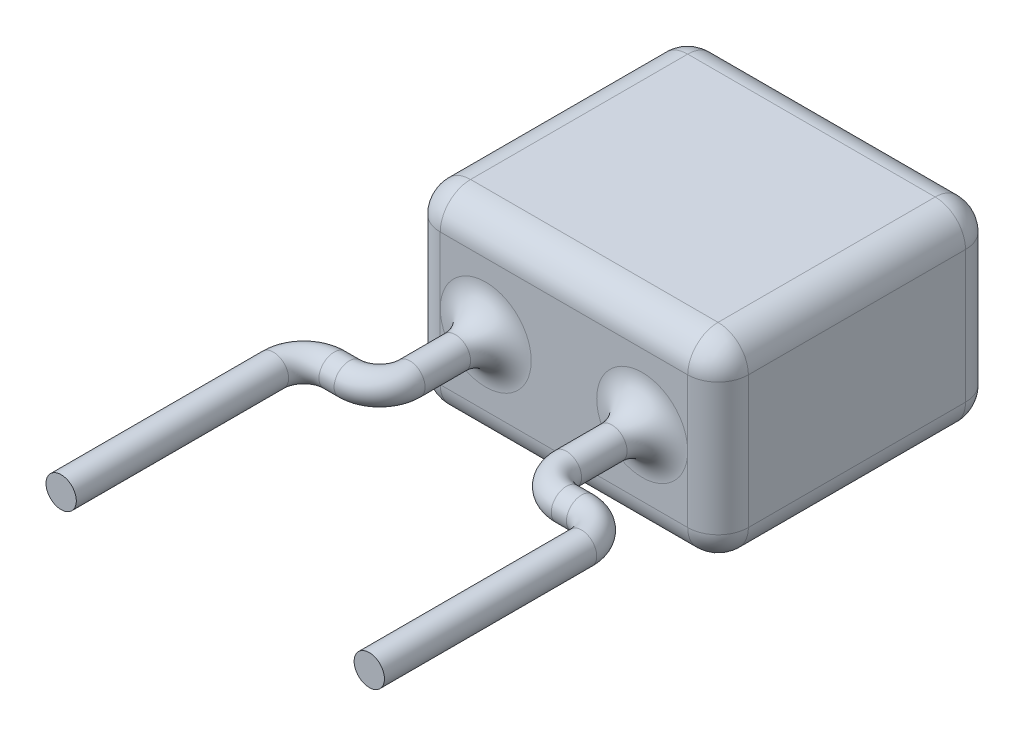
ISO-10303-21;
HEADER;
FILE_DESCRIPTION(('STEP AP214'),'2;1');
FILE_NAME('part.step','',(''),(''),'','','');
FILE_SCHEMA(('AUTOMOTIVE_DESIGN { 1 0 10303 214 1 1 1 1 }'));
ENDSEC;
DATA;
#1=APPLICATION_CONTEXT('core data for automotive mechanical design processes');
#2=APPLICATION_PROTOCOL_DEFINITION('international standard','automotive_design',2000,#1);
#3=PRODUCT_CONTEXT('',#1,'mechanical');
#4=PRODUCT('Part','Part','',(#3));
#5=PRODUCT_RELATED_PRODUCT_CATEGORY('part','',(#4));
#6=PRODUCT_DEFINITION_FORMATION('','',#4);
#7=PRODUCT_DEFINITION_CONTEXT('part definition',#1,'design');
#8=PRODUCT_DEFINITION('design','',#6,#7);
#9=PRODUCT_DEFINITION_SHAPE('','',#8);
#10=(LENGTH_UNIT() NAMED_UNIT(*) SI_UNIT(.MILLI.,.METRE.));
#11=(NAMED_UNIT(*) PLANE_ANGLE_UNIT() SI_UNIT($,.RADIAN.));
#12=(NAMED_UNIT(*) SI_UNIT($,.STERADIAN.) SOLID_ANGLE_UNIT());
#13=UNCERTAINTY_MEASURE_WITH_UNIT(LENGTH_MEASURE(1.E-05),#10,'distance_accuracy_value','');
#14=(GEOMETRIC_REPRESENTATION_CONTEXT(3) GLOBAL_UNCERTAINTY_ASSIGNED_CONTEXT((#13)) GLOBAL_UNIT_ASSIGNED_CONTEXT((#10,
#11,#12)) REPRESENTATION_CONTEXT('',''));
#15=CARTESIAN_POINT('',(0.,0.,0.));
#16=DIRECTION('',(0.,0.,1.));
#17=DIRECTION('',(1.,0.,0.));
#18=AXIS2_PLACEMENT_3D('',#15,#16,#17);
#19=CARTESIAN_POINT('',(-65.,11.1441902468932,3.75));
#20=DIRECTION('',(0.,0.,-1.));
#21=DIRECTION('',(0.,1.,0.));
#22=AXIS2_PLACEMENT_3D('',#19,#20,#21);
#23=PLANE('',#22);
#24=CARTESIAN_POINT('',(-2.53999999999999,0.,3.74999999999999));
#25=DIRECTION('',(0.,0.,1.));
#26=DIRECTION('',(0.,-1.,0.));
#27=AXIS2_PLACEMENT_3D('',#24,#25,#26);
#28=CIRCLE('',#27,0.25);
#29=CARTESIAN_POINT('',(-2.53999999999999,-0.250000000000002,3.74999999999999));
#30=VERTEX_POINT('',#29);
#31=EDGE_CURVE('E165',#30,#30,#28,.F.);
#32=ORIENTED_EDGE('',*,*,#31,.F.);
#33=EDGE_LOOP('',(#32));
#34=FACE_BOUND('',#33,.T.);
#35=ADVANCED_FACE('F17',(#34),#23,.F.);
#36=CARTESIAN_POINT('',(-65.,11.1441902468932,3.75));
#37=DIRECTION('',(0.,0.,-1.));
#38=DIRECTION('',(0.,1.,0.));
#39=AXIS2_PLACEMENT_3D('',#36,#37,#38);
#40=PLANE('',#39);
#41=CARTESIAN_POINT('',(2.54,0.,3.74999999999999));
#42=DIRECTION('',(0.,0.,1.));
#43=DIRECTION('',(0.,-1.,0.));
#44=AXIS2_PLACEMENT_3D('',#41,#42,#43);
#45=CIRCLE('',#44,0.25);
#46=CARTESIAN_POINT('',(2.54,-0.250000000000003,3.74999999999999));
#47=VERTEX_POINT('',#46);
#48=EDGE_CURVE('E161',#47,#47,#45,.F.);
#49=ORIENTED_EDGE('',*,*,#48,.F.);
#50=EDGE_LOOP('',(#49));
#51=FACE_BOUND('',#50,.T.);
#52=ADVANCED_FACE('F770',(#51),#40,.F.);
#53=CARTESIAN_POINT('',(-2.53999999999999,0.,0.25));
#54=DIRECTION('',(0.,0.,1.));
#55=DIRECTION('',(0.,-1.,0.));
#56=AXIS2_PLACEMENT_3D('',#53,#54,#55);
#57=CYLINDRICAL_SURFACE('',#56,0.25);
#58=ORIENTED_EDGE('',*,*,#31,.T.);
#59=EDGE_LOOP('',(#58));
#60=FACE_BOUND('',#59,.T.);
#61=CARTESIAN_POINT('',(-2.54,0.,0.25));
#62=DIRECTION('',(0.,0.,-1.));
#63=DIRECTION('',(-1.,0.,0.));
#64=AXIS2_PLACEMENT_3D('',#61,#62,#63);
#65=CIRCLE('',#64,0.25);
#66=CARTESIAN_POINT('',(-2.79,0.,0.25));
#67=VERTEX_POINT('',#66);
#68=EDGE_CURVE('E164',#67,#67,#65,.T.);
#69=ORIENTED_EDGE('',*,*,#68,.F.);
#70=EDGE_LOOP('',(#69));
#71=FACE_BOUND('',#70,.T.);
#72=ADVANCED_FACE('F763',(#60,#71),#57,.T.);
#73=CARTESIAN_POINT('',(2.54,0.,0.250000000000001));
#74=DIRECTION('',(0.,0.,1.));
#75=DIRECTION('',(0.,-1.,0.));
#76=AXIS2_PLACEMENT_3D('',#73,#74,#75);
#77=CYLINDRICAL_SURFACE('',#76,0.25);
#78=ORIENTED_EDGE('',*,*,#48,.T.);
#79=EDGE_LOOP('',(#78));
#80=FACE_BOUND('',#79,.T.);
#81=CARTESIAN_POINT('',(2.54,0.,0.250000000000001));
#82=DIRECTION('',(0.,0.,1.));
#83=DIRECTION('',(1.,0.,0.));
#84=AXIS2_PLACEMENT_3D('',#81,#82,#83);
#85=CIRCLE('',#84,0.25);
#86=CARTESIAN_POINT('',(2.79,0.,0.250000000000001));
#87=VERTEX_POINT('',#86);
#88=EDGE_CURVE('E363',#87,#87,#85,.F.);
#89=ORIENTED_EDGE('',*,*,#88,.F.);
#90=EDGE_LOOP('',(#89));
#91=FACE_BOUND('',#90,.T.);
#92=ADVANCED_FACE('F358',(#80,#91),#77,.T.);
#93=CARTESIAN_POINT('',(-2.04,0.,0.25));
#94=DIRECTION('',(0.,-1.,0.));
#95=DIRECTION('',(0.,0.,-1.));
#96=AXIS2_PLACEMENT_3D('',#93,#94,#95);
#97=TOROIDAL_SURFACE('',#96,0.5,0.25);
#98=ORIENTED_EDGE('',*,*,#68,.T.);
#99=EDGE_LOOP('',(#98));
#100=FACE_BOUND('',#99,.T.);
#101=CARTESIAN_POINT('',(-2.04,0.,-0.25));
#102=DIRECTION('',(1.,0.,0.));
#103=DIRECTION('',(0.,1.,0.));
#104=AXIS2_PLACEMENT_3D('',#101,#102,#103);
#105=CIRCLE('',#104,0.25);
#106=CARTESIAN_POINT('',(-2.04,0.25,-0.25));
#107=VERTEX_POINT('',#106);
#108=EDGE_CURVE('E345',#107,#107,#105,.T.);
#109=ORIENTED_EDGE('',*,*,#108,.F.);
#110=EDGE_LOOP('',(#109));
#111=FACE_BOUND('',#110,.T.);
#112=ADVANCED_FACE('F354',(#100,#111),#97,.T.);
#113=CARTESIAN_POINT('',(2.04,0.,0.250000000000001));
#114=DIRECTION('',(0.,-1.,0.));
#115=DIRECTION('',(1.,0.,0.));
#116=AXIS2_PLACEMENT_3D('',#113,#114,#115);
#117=TOROIDAL_SURFACE('',#116,0.500000000000001,0.25);
#118=CARTESIAN_POINT('',(2.04,0.,-0.25));
#119=DIRECTION('',(1.,0.,0.));
#120=DIRECTION('',(0.,0.,-1.));
#121=AXIS2_PLACEMENT_3D('',#118,#119,#120);
#122=CIRCLE('',#121,0.25);
#123=CARTESIAN_POINT('',(2.04,0.,-0.499999999999999));
#124=VERTEX_POINT('',#123);
#125=EDGE_CURVE('E342',#124,#124,#122,.F.);
#126=ORIENTED_EDGE('',*,*,#125,.F.);
#127=EDGE_LOOP('',(#126));
#128=FACE_BOUND('',#127,.T.);
#129=ORIENTED_EDGE('',*,*,#88,.T.);
#130=EDGE_LOOP('',(#129));
#131=FACE_BOUND('',#130,.T.);
#132=ADVANCED_FACE('F350',(#128,#131),#117,.T.);
#133=CARTESIAN_POINT('',(-2.04,0.,-0.25));
#134=DIRECTION('',(1.,0.,0.));
#135=DIRECTION('',(0.,1.,0.));
#136=AXIS2_PLACEMENT_3D('',#133,#134,#135);
#137=CYLINDRICAL_SURFACE('',#136,0.25);
#138=ORIENTED_EDGE('',*,*,#108,.T.);
#139=EDGE_LOOP('',(#138));
#140=FACE_BOUND('',#139,.T.);
#141=CARTESIAN_POINT('',(-1.79,0.,-0.249999999999999));
#142=DIRECTION('',(1.,0.,0.));
#143=DIRECTION('',(0.,0.,1.));
#144=AXIS2_PLACEMENT_3D('',#141,#142,#143);
#145=CIRCLE('',#144,0.25);
#146=CARTESIAN_POINT('',(-1.79,0.,0.));
#147=VERTEX_POINT('',#146);
#148=EDGE_CURVE('E339',#147,#147,#145,.T.);
#149=ORIENTED_EDGE('',*,*,#148,.F.);
#150=EDGE_LOOP('',(#149));
#151=FACE_BOUND('',#150,.T.);
#152=ADVANCED_FACE('F353',(#140,#151),#137,.T.);
#153=CARTESIAN_POINT('',(1.79,0.,-0.25));
#154=DIRECTION('',(1.,0.,0.));
#155=DIRECTION('',(0.,0.,-1.));
#156=AXIS2_PLACEMENT_3D('',#153,#154,#155);
#157=CYLINDRICAL_SURFACE('',#156,0.25);
#158=ORIENTED_EDGE('',*,*,#125,.T.);
#159=EDGE_LOOP('',(#158));
#160=FACE_BOUND('',#159,.T.);
#161=CARTESIAN_POINT('',(1.79,0.,-0.25));
#162=DIRECTION('',(1.,0.,0.));
#163=DIRECTION('',(0.,0.,1.));
#164=AXIS2_PLACEMENT_3D('',#161,#162,#163);
#165=CIRCLE('',#164,0.25);
#166=CARTESIAN_POINT('',(1.79,0.,0.));
#167=VERTEX_POINT('',#166);
#168=EDGE_CURVE('E336',#167,#167,#165,.F.);
#169=ORIENTED_EDGE('',*,*,#168,.F.);
#170=EDGE_LOOP('',(#169));
#171=FACE_BOUND('',#170,.T.);
#172=ADVANCED_FACE('F330',(#160,#171),#157,.T.);
#173=CARTESIAN_POINT('',(-1.79,0.,-0.749999999999999));
#174=DIRECTION('',(0.,1.,0.));
#175=DIRECTION('',(0.,0.,1.));
#176=AXIS2_PLACEMENT_3D('',#173,#174,#175);
#177=TOROIDAL_SURFACE('',#176,0.499999999999999,0.25);
#178=CARTESIAN_POINT('',(-1.29,0.,-0.749999999999999));
#179=DIRECTION('',(0.,0.,-1.));
#180=DIRECTION('',(0.,1.,0.));
#181=AXIS2_PLACEMENT_3D('',#178,#179,#180);
#182=CIRCLE('',#181,0.25);
#183=CARTESIAN_POINT('',(-1.29,0.25,-0.75));
#184=VERTEX_POINT('',#183);
#185=EDGE_CURVE('E335',#184,#184,#182,.T.);
#186=ORIENTED_EDGE('',*,*,#185,.F.);
#187=EDGE_LOOP('',(#186));
#188=FACE_BOUND('',#187,.T.);
#189=ORIENTED_EDGE('',*,*,#148,.T.);
#190=EDGE_LOOP('',(#189));
#191=FACE_BOUND('',#190,.T.);
#192=ADVANCED_FACE('F325',(#188,#191),#177,.T.);
#193=CARTESIAN_POINT('',(1.79,0.,-0.749999999999999));
#194=DIRECTION('',(0.,1.,0.));
#195=DIRECTION('',(-1.,0.,0.));
#196=AXIS2_PLACEMENT_3D('',#193,#194,#195);
#197=TOROIDAL_SURFACE('',#196,0.499999999999999,0.25);
#198=ORIENTED_EDGE('',*,*,#168,.T.);
#199=EDGE_LOOP('',(#198));
#200=FACE_BOUND('',#199,.T.);
#201=CARTESIAN_POINT('',(1.29,0.,-0.749999999999998));
#202=DIRECTION('',(0.,0.,1.));
#203=DIRECTION('',(0.,-1.,0.));
#204=AXIS2_PLACEMENT_3D('',#201,#202,#203);
#205=CIRCLE('',#204,0.25);
#206=CARTESIAN_POINT('',(1.29,-0.250000000000003,-0.749999999999999));
#207=VERTEX_POINT('',#206);
#208=EDGE_CURVE('E231',#207,#207,#205,.F.);
#209=ORIENTED_EDGE('',*,*,#208,.F.);
#210=EDGE_LOOP('',(#209));
#211=FACE_BOUND('',#210,.T.);
#212=ADVANCED_FACE('F320',(#200,#211),#197,.T.);
#213=CARTESIAN_POINT('',(-1.29,0.,-0.749999999999999));
#214=DIRECTION('',(0.,0.,-1.));
#215=DIRECTION('',(0.,1.,0.));
#216=AXIS2_PLACEMENT_3D('',#213,#214,#215);
#217=CYLINDRICAL_SURFACE('',#216,0.25);
#218=ORIENTED_EDGE('',*,*,#185,.T.);
#219=EDGE_LOOP('',(#218));
#220=FACE_BOUND('',#219,.T.);
#221=CARTESIAN_POINT('',(-1.29,0.,-1.5));
#222=DIRECTION('',(0.,0.,1.));
#223=DIRECTION('',(1.,0.,0.));
#224=AXIS2_PLACEMENT_3D('',#221,#222,#223);
#225=CIRCLE('',#224,0.25);
#226=CARTESIAN_POINT('',(-1.04,0.,-1.5));
#227=VERTEX_POINT('',#226);
#228=EDGE_CURVE('E310',#227,#227,#225,.T.);
#229=ORIENTED_EDGE('',*,*,#228,.T.);
#230=EDGE_LOOP('',(#229));
#231=FACE_BOUND('',#230,.T.);
#232=ADVANCED_FACE('F324',(#220,#231),#217,.T.);
#233=CARTESIAN_POINT('',(1.29,0.,-2.5));
#234=DIRECTION('',(0.,0.,1.));
#235=DIRECTION('',(0.,-1.,0.));
#236=AXIS2_PLACEMENT_3D('',#233,#234,#235);
#237=CYLINDRICAL_SURFACE('',#236,0.25);
#238=CARTESIAN_POINT('',(1.29,0.,-1.5));
#239=DIRECTION('',(0.,0.,1.));
#240=DIRECTION('',(1.,0.,0.));
#241=AXIS2_PLACEMENT_3D('',#238,#239,#240);
#242=CIRCLE('',#241,0.25);
#243=CARTESIAN_POINT('',(1.54,0.,-1.5));
#244=VERTEX_POINT('',#243);
#245=EDGE_CURVE('E227',#244,#244,#242,.T.);
#246=ORIENTED_EDGE('',*,*,#245,.T.);
#247=EDGE_LOOP('',(#246));
#248=FACE_BOUND('',#247,.T.);
#249=ORIENTED_EDGE('',*,*,#208,.T.);
#250=EDGE_LOOP('',(#249));
#251=FACE_BOUND('',#250,.T.);
#252=ADVANCED_FACE('F717',(#248,#251),#237,.T.);
#253=CARTESIAN_POINT('',(2.04,-1.09000000000001,-2.5));
#254=DIRECTION('',(1.,0.,0.));
#255=DIRECTION('',(0.,0.,-1.));
#256=AXIS2_PLACEMENT_3D('',#253,#254,#255);
#257=SPHERICAL_SURFACE('',#256,0.5);
#258=CARTESIAN_POINT('',(2.04,-1.09000000000001,-2.5));
#259=DIRECTION('',(0.,1.,0.));
#260=DIRECTION('',(-1.,0.,0.));
#261=AXIS2_PLACEMENT_3D('',#258,#259,#260);
#262=CIRCLE('',#261,0.5);
#263=CARTESIAN_POINT('',(2.04,-1.09000000000001,-2.));
#264=VERTEX_POINT('',#263);
#265=CARTESIAN_POINT('',(2.54,-1.09000000000001,-2.5));
#266=VERTEX_POINT('',#265);
#267=EDGE_CURVE('E218',#264,#266,#262,.T.);
#268=ORIENTED_EDGE('',*,*,#267,.F.);
#269=CARTESIAN_POINT('',(2.04,-1.09000000000001,-2.5));
#270=DIRECTION('',(1.,0.,0.));
#271=DIRECTION('',(0.,1.,0.));
#272=AXIS2_PLACEMENT_3D('',#269,#270,#271);
#273=CIRCLE('',#272,0.5);
#274=CARTESIAN_POINT('',(2.04,-1.59,-2.5));
#275=VERTEX_POINT('',#274);
#276=EDGE_CURVE('E128',#275,#264,#273,.F.);
#277=ORIENTED_EDGE('',*,*,#276,.F.);
#278=CARTESIAN_POINT('',(2.04,-1.08999999999999,-2.5));
#279=DIRECTION('',(0.,0.,1.));
#280=DIRECTION('',(1.,0.,0.));
#281=AXIS2_PLACEMENT_3D('',#278,#279,#280);
#282=CIRCLE('',#281,0.5);
#283=EDGE_CURVE('E285',#266,#275,#282,.F.);
#284=ORIENTED_EDGE('',*,*,#283,.F.);
#285=EDGE_LOOP('',(#268,#277,#284));
#286=FACE_BOUND('',#285,.T.);
#287=ADVANCED_FACE('F260',(#286),#257,.T.);
#288=CARTESIAN_POINT('',(2.04,-1.09000000000001,-6.08));
#289=DIRECTION('',(1.,0.,0.));
#290=DIRECTION('',(0.,0.,-1.));
#291=AXIS2_PLACEMENT_3D('',#288,#289,#290);
#292=SPHERICAL_SURFACE('',#291,0.5);
#293=CARTESIAN_POINT('',(2.04,-1.09000000000001,-6.08));
#294=DIRECTION('',(0.,1.,0.));
#295=DIRECTION('',(-1.,0.,0.));
#296=AXIS2_PLACEMENT_3D('',#293,#294,#295);
#297=CIRCLE('',#296,0.5);
#298=CARTESIAN_POINT('',(2.54,-1.09000000000001,-6.08));
#299=VERTEX_POINT('',#298);
#300=CARTESIAN_POINT('',(2.04,-1.09,-6.58));
#301=VERTEX_POINT('',#300);
#302=EDGE_CURVE('E269',#299,#301,#297,.T.);
#303=ORIENTED_EDGE('',*,*,#302,.F.);
#304=CARTESIAN_POINT('',(2.04,-1.08999999999999,-6.08));
#305=DIRECTION('',(0.,0.,1.));
#306=DIRECTION('',(1.,0.,0.));
#307=AXIS2_PLACEMENT_3D('',#304,#305,#306);
#308=CIRCLE('',#307,0.5);
#309=CARTESIAN_POINT('',(2.04,-1.59,-6.08));
#310=VERTEX_POINT('',#309);
#311=EDGE_CURVE('E226',#310,#299,#308,.T.);
#312=ORIENTED_EDGE('',*,*,#311,.F.);
#313=CARTESIAN_POINT('',(2.04,-1.09000000000001,-6.08));
#314=DIRECTION('',(1.,0.,0.));
#315=DIRECTION('',(0.,1.,0.));
#316=AXIS2_PLACEMENT_3D('',#313,#314,#315);
#317=CIRCLE('',#316,0.5);
#318=EDGE_CURVE('E272',#301,#310,#317,.F.);
#319=ORIENTED_EDGE('',*,*,#318,.F.);
#320=EDGE_LOOP('',(#303,#312,#319));
#321=FACE_BOUND('',#320,.T.);
#322=ADVANCED_FACE('F255',(#321),#292,.T.);
#323=CARTESIAN_POINT('',(2.54,-1.58999999999999,-6.58));
#324=DIRECTION('',(0.,-1.,0.));
#325=DIRECTION('',(1.,0.,0.));
#326=AXIS2_PLACEMENT_3D('',#323,#324,#325);
#327=PLANE('',#326);
#328=DIRECTION('',(1.,0.,0.));
#329=VECTOR('',#328,1.);
#330=CARTESIAN_POINT('',(2.54,-1.59000000000001,-6.08));
#331=LINE('',#330,#329);
#332=CARTESIAN_POINT('',(-2.04,-1.59,-6.08));
#333=VERTEX_POINT('',#332);
#334=EDGE_CURVE('E546',#310,#333,#331,.F.);
#335=ORIENTED_EDGE('',*,*,#334,.F.);
#336=DIRECTION('',(0.,0.,1.));
#337=VECTOR('',#336,1.);
#338=CARTESIAN_POINT('',(2.04,-1.58999999999999,-6.58));
#339=LINE('',#338,#337);
#340=EDGE_CURVE('E273',#275,#310,#339,.F.);
#341=ORIENTED_EDGE('',*,*,#340,.F.);
#342=DIRECTION('',(1.,0.,0.));
#343=VECTOR('',#342,1.);
#344=CARTESIAN_POINT('',(0.,-1.59000000000001,-2.5));
#345=LINE('',#344,#343);
#346=CARTESIAN_POINT('',(-2.04,-1.59,-2.5));
#347=VERTEX_POINT('',#346);
#348=EDGE_CURVE('E127',#347,#275,#345,.T.);
#349=ORIENTED_EDGE('',*,*,#348,.F.);
#350=DIRECTION('',(0.,0.,1.));
#351=VECTOR('',#350,1.);
#352=CARTESIAN_POINT('',(-2.04,-1.58999999999999,-6.58));
#353=LINE('',#352,#351);
#354=EDGE_CURVE('E529',#333,#347,#353,.T.);
#355=ORIENTED_EDGE('',*,*,#354,.F.);
#356=EDGE_LOOP('',(#335,#341,#349,#355));
#357=FACE_BOUND('',#356,.T.);
#358=ADVANCED_FACE('F252',(#357),#327,.T.);
#359=CARTESIAN_POINT('',(-2.04,-1.09000000000001,-2.5));
#360=DIRECTION('',(1.,0.,0.));
#361=DIRECTION('',(0.,0.,-1.));
#362=AXIS2_PLACEMENT_3D('',#359,#360,#361);
#363=SPHERICAL_SURFACE('',#362,0.5);
#364=CARTESIAN_POINT('',(-2.04,-1.09000000000001,-2.5));
#365=DIRECTION('',(1.,0.,0.));
#366=DIRECTION('',(0.,1.,0.));
#367=AXIS2_PLACEMENT_3D('',#364,#365,#366);
#368=CIRCLE('',#367,0.5);
#369=CARTESIAN_POINT('',(-2.04,-1.09000000000001,-2.));
#370=VERTEX_POINT('',#369);
#371=EDGE_CURVE('E118',#370,#347,#368,.T.);
#372=ORIENTED_EDGE('',*,*,#371,.F.);
#373=CARTESIAN_POINT('',(-2.04,-1.09000000000001,-2.5));
#374=DIRECTION('',(0.,-1.,0.));
#375=DIRECTION('',(1.,0.,0.));
#376=AXIS2_PLACEMENT_3D('',#373,#374,#375);
#377=CIRCLE('',#376,0.5);
#378=CARTESIAN_POINT('',(-2.54,-1.09000000000001,-2.5));
#379=VERTEX_POINT('',#378);
#380=EDGE_CURVE('E121',#379,#370,#377,.F.);
#381=ORIENTED_EDGE('',*,*,#380,.F.);
#382=CARTESIAN_POINT('',(-2.04,-1.08999999999999,-2.5));
#383=DIRECTION('',(0.,0.,1.));
#384=DIRECTION('',(1.,0.,0.));
#385=AXIS2_PLACEMENT_3D('',#382,#383,#384);
#386=CIRCLE('',#385,0.5);
#387=EDGE_CURVE('E123',#347,#379,#386,.F.);
#388=ORIENTED_EDGE('',*,*,#387,.F.);
#389=EDGE_LOOP('',(#372,#381,#388));
#390=FACE_BOUND('',#389,.T.);
#391=ADVANCED_FACE('F120',(#390),#363,.T.);
#392=CARTESIAN_POINT('',(-2.04,-1.09000000000001,-6.08));
#393=DIRECTION('',(1.,0.,0.));
#394=DIRECTION('',(0.,0.,-1.));
#395=AXIS2_PLACEMENT_3D('',#392,#393,#394);
#396=SPHERICAL_SURFACE('',#395,0.5);
#397=CARTESIAN_POINT('',(-2.04,-1.09000000000001,-6.08));
#398=DIRECTION('',(1.,0.,0.));
#399=DIRECTION('',(0.,1.,0.));
#400=AXIS2_PLACEMENT_3D('',#397,#398,#399);
#401=CIRCLE('',#400,0.5);
#402=CARTESIAN_POINT('',(-2.04,-1.09,-6.58));
#403=VERTEX_POINT('',#402);
#404=EDGE_CURVE('E537',#333,#403,#401,.T.);
#405=ORIENTED_EDGE('',*,*,#404,.F.);
#406=CARTESIAN_POINT('',(-2.04,-1.08999999999999,-6.08));
#407=DIRECTION('',(0.,0.,1.));
#408=DIRECTION('',(1.,0.,0.));
#409=AXIS2_PLACEMENT_3D('',#406,#407,#408);
#410=CIRCLE('',#409,0.5);
#411=CARTESIAN_POINT('',(-2.54,-1.09000000000001,-6.08));
#412=VERTEX_POINT('',#411);
#413=EDGE_CURVE('E532',#412,#333,#410,.T.);
#414=ORIENTED_EDGE('',*,*,#413,.F.);
#415=CARTESIAN_POINT('',(-2.04,-1.08999999999999,-6.08));
#416=DIRECTION('',(0.,-1.,0.));
#417=DIRECTION('',(1.,0.,0.));
#418=AXIS2_PLACEMENT_3D('',#415,#416,#417);
#419=CIRCLE('',#418,0.5);
#420=EDGE_CURVE('E140',#403,#412,#419,.F.);
#421=ORIENTED_EDGE('',*,*,#420,.F.);
#422=EDGE_LOOP('',(#405,#414,#421));
#423=FACE_BOUND('',#422,.T.);
#424=ADVANCED_FACE('F246',(#423),#396,.T.);
#425=CARTESIAN_POINT('',(0.,-1.09000000000001,-2.5));
#426=DIRECTION('',(1.,0.,0.));
#427=DIRECTION('',(0.,1.,0.));
#428=AXIS2_PLACEMENT_3D('',#425,#426,#427);
#429=CYLINDRICAL_SURFACE('',#428,0.5);
#430=ORIENTED_EDGE('',*,*,#371,.T.);
#431=ORIENTED_EDGE('',*,*,#348,.T.);
#432=ORIENTED_EDGE('',*,*,#276,.T.);
#433=DIRECTION('',(1.,0.,0.));
#434=VECTOR('',#433,1.);
#435=CARTESIAN_POINT('',(0.,-1.09000000000001,-2.));
#436=LINE('',#435,#434);
#437=EDGE_CURVE('E145',#370,#264,#436,.T.);
#438=ORIENTED_EDGE('',*,*,#437,.F.);
#439=EDGE_LOOP('',(#430,#431,#432,#438));
#440=FACE_BOUND('',#439,.T.);
#441=ADVANCED_FACE('F146',(#440),#429,.T.);
#442=CARTESIAN_POINT('',(-1.29,0.,-1.5));
#443=DIRECTION('',(0.,0.,1.));
#444=DIRECTION('',(1.,0.,0.));
#445=AXIS2_PLACEMENT_3D('',#442,#443,#444);
#446=TOROIDAL_SURFACE('',#445,0.75,0.5);
#447=CARTESIAN_POINT('',(-1.29,0.,-2.));
#448=DIRECTION('',(0.,0.,1.));
#449=DIRECTION('',(-1.,0.,0.));
#450=AXIS2_PLACEMENT_3D('',#447,#448,#449);
#451=CIRCLE('',#450,0.75);
#452=CARTESIAN_POINT('',(-0.54,0.,-2.));
#453=VERTEX_POINT('',#452);
#454=CARTESIAN_POINT('',(-2.04,0.,-2.));
#455=VERTEX_POINT('',#454);
#456=EDGE_CURVE('E213',#453,#455,#451,.F.);
#457=ORIENTED_EDGE('',*,*,#456,.F.);
#458=CARTESIAN_POINT('',(-1.29,0.,-2.));
#459=DIRECTION('',(0.,0.,1.));
#460=DIRECTION('',(1.,0.,0.));
#461=AXIS2_PLACEMENT_3D('',#458,#459,#460);
#462=CIRCLE('',#461,0.750000000000001);
#463=EDGE_CURVE('E370',#455,#453,#462,.F.);
#464=ORIENTED_EDGE('',*,*,#463,.F.);
#465=EDGE_LOOP('',(#457,#464));
#466=FACE_BOUND('',#465,.T.);
#467=ORIENTED_EDGE('',*,*,#228,.F.);
#468=EDGE_LOOP('',(#467));
#469=FACE_BOUND('',#468,.T.);
#470=ADVANCED_FACE('F187',(#466,#469),#446,.F.);
#471=CARTESIAN_POINT('',(1.29,0.,-1.5));
#472=DIRECTION('',(0.,0.,1.));
#473=DIRECTION('',(1.,0.,0.));
#474=AXIS2_PLACEMENT_3D('',#471,#472,#473);
#475=TOROIDAL_SURFACE('',#474,0.75,0.5);
#476=ORIENTED_EDGE('',*,*,#245,.F.);
#477=EDGE_LOOP('',(#476));
#478=FACE_BOUND('',#477,.T.);
#479=CARTESIAN_POINT('',(1.29,0.,-2.));
#480=DIRECTION('',(0.,0.,1.));
#481=DIRECTION('',(-1.,0.,0.));
#482=AXIS2_PLACEMENT_3D('',#479,#480,#481);
#483=CIRCLE('',#482,0.75);
#484=CARTESIAN_POINT('',(2.04,0.,-2.));
#485=VERTEX_POINT('',#484);
#486=CARTESIAN_POINT('',(0.539999999999999,0.,-2.));
#487=VERTEX_POINT('',#486);
#488=EDGE_CURVE('E171',#485,#487,#483,.F.);
#489=ORIENTED_EDGE('',*,*,#488,.F.);
#490=CARTESIAN_POINT('',(1.29,0.,-2.));
#491=DIRECTION('',(0.,0.,1.));
#492=DIRECTION('',(1.,0.,0.));
#493=AXIS2_PLACEMENT_3D('',#490,#491,#492);
#494=CIRCLE('',#493,0.75);
#495=EDGE_CURVE('E200',#487,#485,#494,.F.);
#496=ORIENTED_EDGE('',*,*,#495,.F.);
#497=EDGE_LOOP('',(#489,#496));
#498=FACE_BOUND('',#497,.T.);
#499=ADVANCED_FACE('F176',(#478,#498),#475,.F.);
#500=CARTESIAN_POINT('',(2.04,0.,-2.5));
#501=DIRECTION('',(0.,1.,0.));
#502=DIRECTION('',(-1.,0.,0.));
#503=AXIS2_PLACEMENT_3D('',#500,#501,#502);
#504=CYLINDRICAL_SURFACE('',#503,0.5);
#505=DIRECTION('',(0.,1.,0.));
#506=VECTOR('',#505,1.);
#507=CARTESIAN_POINT('',(2.04,0.,-2.));
#508=LINE('',#507,#506);
#509=CARTESIAN_POINT('',(2.04,1.08999999999999,-2.));
#510=VERTEX_POINT('',#509);
#511=EDGE_CURVE('E149',#264,#510,#508,.T.);
#512=ORIENTED_EDGE('',*,*,#511,.F.);
#513=ORIENTED_EDGE('',*,*,#267,.T.);
#514=DIRECTION('',(0.,1.,0.));
#515=VECTOR('',#514,1.);
#516=CARTESIAN_POINT('',(2.54,1.59000000000001,-2.5));
#517=LINE('',#516,#515);
#518=CARTESIAN_POINT('',(2.54,1.09,-2.5));
#519=VERTEX_POINT('',#518);
#520=EDGE_CURVE('E296',#519,#266,#517,.F.);
#521=ORIENTED_EDGE('',*,*,#520,.F.);
#522=CARTESIAN_POINT('',(2.04,1.08999999999999,-2.5));
#523=DIRECTION('',(0.,-1.,0.));
#524=DIRECTION('',(1.,0.,0.));
#525=AXIS2_PLACEMENT_3D('',#522,#523,#524);
#526=CIRCLE('',#525,0.5);
#527=EDGE_CURVE('E376',#510,#519,#526,.F.);
#528=ORIENTED_EDGE('',*,*,#527,.F.);
#529=EDGE_LOOP('',(#512,#513,#521,#528));
#530=FACE_BOUND('',#529,.T.);
#531=ADVANCED_FACE('F186',(#530),#504,.T.);
#532=CARTESIAN_POINT('',(2.04,-1.08999999999999,-6.58));
#533=DIRECTION('',(0.,0.,1.));
#534=DIRECTION('',(1.,0.,0.));
#535=AXIS2_PLACEMENT_3D('',#532,#533,#534);
#536=CYLINDRICAL_SURFACE('',#535,0.5);
#537=ORIENTED_EDGE('',*,*,#283,.T.);
#538=ORIENTED_EDGE('',*,*,#340,.T.);
#539=ORIENTED_EDGE('',*,*,#311,.T.);
#540=DIRECTION('',(0.,0.,1.));
#541=VECTOR('',#540,1.);
#542=CARTESIAN_POINT('',(2.54,-1.09000000000001,-6.58));
#543=LINE('',#542,#541);
#544=EDGE_CURVE('E291',#266,#299,#543,.F.);
#545=ORIENTED_EDGE('',*,*,#544,.F.);
#546=EDGE_LOOP('',(#537,#538,#539,#545));
#547=FACE_BOUND('',#546,.T.);
#548=ADVANCED_FACE('F571',(#547),#536,.T.);
#549=CARTESIAN_POINT('',(2.04,1.58999999999999,-6.08));
#550=DIRECTION('',(0.,1.,0.));
#551=DIRECTION('',(-1.,0.,0.));
#552=AXIS2_PLACEMENT_3D('',#549,#550,#551);
#553=CYLINDRICAL_SURFACE('',#552,0.5);
#554=ORIENTED_EDGE('',*,*,#302,.T.);
#555=DIRECTION('',(0.,1.,0.));
#556=VECTOR('',#555,1.);
#557=CARTESIAN_POINT('',(2.04,0.,-6.58));
#558=LINE('',#557,#556);
#559=CARTESIAN_POINT('',(2.04,1.09,-6.58));
#560=VERTEX_POINT('',#559);
#561=EDGE_CURVE('E276',#560,#301,#558,.F.);
#562=ORIENTED_EDGE('',*,*,#561,.F.);
#563=CARTESIAN_POINT('',(2.04,1.08999999999999,-6.08));
#564=DIRECTION('',(0.,1.,0.));
#565=DIRECTION('',(1.,0.,0.));
#566=AXIS2_PLACEMENT_3D('',#563,#564,#565);
#567=CIRCLE('',#566,0.5);
#568=CARTESIAN_POINT('',(2.54,1.09,-6.08));
#569=VERTEX_POINT('',#568);
#570=EDGE_CURVE('E280',#569,#560,#567,.T.);
#571=ORIENTED_EDGE('',*,*,#570,.F.);
#572=DIRECTION('',(0.,1.,0.));
#573=VECTOR('',#572,1.);
#574=CARTESIAN_POINT('',(2.54,1.59000000000001,-6.08));
#575=LINE('',#574,#573);
#576=EDGE_CURVE('E288',#299,#569,#575,.T.);
#577=ORIENTED_EDGE('',*,*,#576,.F.);
#578=EDGE_LOOP('',(#554,#562,#571,#577));
#579=FACE_BOUND('',#578,.T.);
#580=ADVANCED_FACE('F663',(#579),#553,.T.);
#581=CARTESIAN_POINT('',(2.54,-1.09000000000001,-6.08));
#582=DIRECTION('',(1.,0.,0.));
#583=DIRECTION('',(0.,1.,0.));
#584=AXIS2_PLACEMENT_3D('',#581,#582,#583);
#585=CYLINDRICAL_SURFACE('',#584,0.5);
#586=ORIENTED_EDGE('',*,*,#404,.T.);
#587=DIRECTION('',(-1.,0.,0.));
#588=VECTOR('',#587,1.);
#589=CARTESIAN_POINT('',(0.,-1.08999999999999,-6.58));
#590=LINE('',#589,#588);
#591=EDGE_CURVE('E279',#301,#403,#590,.T.);
#592=ORIENTED_EDGE('',*,*,#591,.F.);
#593=ORIENTED_EDGE('',*,*,#318,.T.);
#594=ORIENTED_EDGE('',*,*,#334,.T.);
#595=EDGE_LOOP('',(#586,#592,#593,#594));
#596=FACE_BOUND('',#595,.T.);
#597=ADVANCED_FACE('F567',(#596),#585,.T.);
#598=CARTESIAN_POINT('',(-2.04,-1.08999999999999,-6.58));
#599=DIRECTION('',(0.,0.,1.));
#600=DIRECTION('',(1.,0.,0.));
#601=AXIS2_PLACEMENT_3D('',#598,#599,#600);
#602=CYLINDRICAL_SURFACE('',#601,0.5);
#603=ORIENTED_EDGE('',*,*,#387,.T.);
#604=DIRECTION('',(0.,0.,1.));
#605=VECTOR('',#604,1.);
#606=CARTESIAN_POINT('',(-2.53999999999999,-1.09000000000001,-6.58));
#607=LINE('',#606,#605);
#608=EDGE_CURVE('E958',#412,#379,#607,.T.);
#609=ORIENTED_EDGE('',*,*,#608,.F.);
#610=ORIENTED_EDGE('',*,*,#413,.T.);
#611=ORIENTED_EDGE('',*,*,#354,.T.);
#612=EDGE_LOOP('',(#603,#609,#610,#611));
#613=FACE_BOUND('',#612,.T.);
#614=ADVANCED_FACE('F650',(#613),#602,.T.);
#615=CARTESIAN_POINT('',(-2.04,0.,-2.5));
#616=DIRECTION('',(0.,-1.,0.));
#617=DIRECTION('',(1.,0.,0.));
#618=AXIS2_PLACEMENT_3D('',#615,#616,#617);
#619=CYLINDRICAL_SURFACE('',#618,0.5);
#620=DIRECTION('',(0.,1.,0.));
#621=VECTOR('',#620,1.);
#622=CARTESIAN_POINT('',(-2.04,0.,-2.));
#623=LINE('',#622,#621);
#624=CARTESIAN_POINT('',(-2.04,1.08999999999999,-2.));
#625=VERTEX_POINT('',#624);
#626=EDGE_CURVE('E135',#625,#370,#623,.F.);
#627=ORIENTED_EDGE('',*,*,#626,.F.);
#628=CARTESIAN_POINT('',(-2.04,1.08999999999999,-2.5));
#629=DIRECTION('',(0.,-1.,0.));
#630=DIRECTION('',(1.,0.,0.));
#631=AXIS2_PLACEMENT_3D('',#628,#629,#630);
#632=CIRCLE('',#631,0.5);
#633=CARTESIAN_POINT('',(-2.54,1.08999999999999,-2.5));
#634=VERTEX_POINT('',#633);
#635=EDGE_CURVE('E141',#625,#634,#632,.T.);
#636=ORIENTED_EDGE('',*,*,#635,.T.);
#637=DIRECTION('',(0.,-1.,0.));
#638=VECTOR('',#637,1.);
#639=CARTESIAN_POINT('',(-2.53999999999999,1.59000000000001,-2.5));
#640=LINE('',#639,#638);
#641=EDGE_CURVE('E138',#379,#634,#640,.F.);
#642=ORIENTED_EDGE('',*,*,#641,.F.);
#643=ORIENTED_EDGE('',*,*,#380,.T.);
#644=EDGE_LOOP('',(#627,#636,#642,#643));
#645=FACE_BOUND('',#644,.T.);
#646=ADVANCED_FACE('F133',(#645),#619,.T.);
#647=CARTESIAN_POINT('',(-2.04,1.58999999999999,-6.08));
#648=DIRECTION('',(0.,-1.,0.));
#649=DIRECTION('',(1.,0.,0.));
#650=AXIS2_PLACEMENT_3D('',#647,#648,#649);
#651=CYLINDRICAL_SURFACE('',#650,0.5);
#652=ORIENTED_EDGE('',*,*,#420,.T.);
#653=DIRECTION('',(0.,-1.,0.));
#654=VECTOR('',#653,1.);
#655=CARTESIAN_POINT('',(-2.53999999999999,1.59000000000001,-6.08));
#656=LINE('',#655,#654);
#657=CARTESIAN_POINT('',(-2.54,1.08999999999999,-6.08));
#658=VERTEX_POINT('',#657);
#659=EDGE_CURVE('E504',#658,#412,#656,.T.);
#660=ORIENTED_EDGE('',*,*,#659,.F.);
#661=CARTESIAN_POINT('',(-2.04,1.08999999999999,-6.08));
#662=DIRECTION('',(0.,1.,0.));
#663=DIRECTION('',(1.,0.,0.));
#664=AXIS2_PLACEMENT_3D('',#661,#662,#663);
#665=CIRCLE('',#664,0.5);
#666=CARTESIAN_POINT('',(-2.04,1.09,-6.58));
#667=VERTEX_POINT('',#666);
#668=EDGE_CURVE('E450',#667,#658,#665,.T.);
#669=ORIENTED_EDGE('',*,*,#668,.F.);
#670=DIRECTION('',(0.,1.,0.));
#671=VECTOR('',#670,1.);
#672=CARTESIAN_POINT('',(-2.04,0.,-6.58));
#673=LINE('',#672,#671);
#674=EDGE_CURVE('E555',#403,#667,#673,.T.);
#675=ORIENTED_EDGE('',*,*,#674,.F.);
#676=EDGE_LOOP('',(#652,#660,#669,#675));
#677=FACE_BOUND('',#676,.T.);
#678=ADVANCED_FACE('F461',(#677),#651,.T.);
#679=CARTESIAN_POINT('',(0.,0.,-2.));
#680=DIRECTION('',(0.,0.,1.));
#681=DIRECTION('',(1.,0.,0.));
#682=AXIS2_PLACEMENT_3D('',#679,#680,#681);
#683=PLANE('',#682);
#684=ORIENTED_EDGE('',*,*,#488,.T.);
#685=ORIENTED_EDGE('',*,*,#495,.T.);
#686=EDGE_LOOP('',(#684,#685));
#687=FACE_BOUND('',#686,.T.);
#688=ORIENTED_EDGE('',*,*,#463,.T.);
#689=ORIENTED_EDGE('',*,*,#456,.T.);
#690=EDGE_LOOP('',(#688,#689));
#691=FACE_BOUND('',#690,.T.);
#692=ORIENTED_EDGE('',*,*,#511,.T.);
#693=DIRECTION('',(-1.,0.,0.));
#694=VECTOR('',#693,1.);
#695=CARTESIAN_POINT('',(0.,1.08999999999999,-2.));
#696=LINE('',#695,#694);
#697=EDGE_CURVE('E154',#625,#510,#696,.F.);
#698=ORIENTED_EDGE('',*,*,#697,.F.);
#699=ORIENTED_EDGE('',*,*,#626,.T.);
#700=ORIENTED_EDGE('',*,*,#437,.T.);
#701=EDGE_LOOP('',(#692,#698,#699,#700));
#702=FACE_BOUND('',#701,.T.);
#703=ADVANCED_FACE('F152',(#687,#691,#702),#683,.T.);
#704=CARTESIAN_POINT('',(2.04,1.08999999999999,-2.5));
#705=DIRECTION('',(1.,0.,0.));
#706=DIRECTION('',(0.,0.,-1.));
#707=AXIS2_PLACEMENT_3D('',#704,#705,#706);
#708=SPHERICAL_SURFACE('',#707,0.5);
#709=CARTESIAN_POINT('',(2.04,1.09000000000001,-2.5));
#710=DIRECTION('',(0.,0.,1.));
#711=DIRECTION('',(1.,0.,0.));
#712=AXIS2_PLACEMENT_3D('',#709,#710,#711);
#713=CIRCLE('',#712,0.5);
#714=CARTESIAN_POINT('',(2.04,1.59,-2.5));
#715=VERTEX_POINT('',#714);
#716=EDGE_CURVE('E390',#715,#519,#713,.F.);
#717=ORIENTED_EDGE('',*,*,#716,.F.);
#718=CARTESIAN_POINT('',(2.04,1.08999999999999,-2.5));
#719=DIRECTION('',(-1.,0.,0.));
#720=DIRECTION('',(0.,-1.,0.));
#721=AXIS2_PLACEMENT_3D('',#718,#719,#720);
#722=CIRCLE('',#721,0.5);
#723=EDGE_CURVE('E499',#510,#715,#722,.T.);
#724=ORIENTED_EDGE('',*,*,#723,.F.);
#725=ORIENTED_EDGE('',*,*,#527,.T.);
#726=EDGE_LOOP('',(#717,#724,#725));
#727=FACE_BOUND('',#726,.T.);
#728=ADVANCED_FACE('F455',(#727),#708,.T.);
#729=CARTESIAN_POINT('',(2.54,1.59000000000001,-6.58));
#730=DIRECTION('',(1.,0.,0.));
#731=DIRECTION('',(0.,1.,0.));
#732=AXIS2_PLACEMENT_3D('',#729,#730,#731);
#733=PLANE('',#732);
#734=ORIENTED_EDGE('',*,*,#576,.T.);
#735=DIRECTION('',(0.,0.,1.));
#736=VECTOR('',#735,1.);
#737=CARTESIAN_POINT('',(2.54,1.09000000000001,-6.58));
#738=LINE('',#737,#736);
#739=EDGE_CURVE('E393',#519,#569,#738,.F.);
#740=ORIENTED_EDGE('',*,*,#739,.F.);
#741=ORIENTED_EDGE('',*,*,#520,.T.);
#742=ORIENTED_EDGE('',*,*,#544,.T.);
#743=EDGE_LOOP('',(#734,#740,#741,#742));
#744=FACE_BOUND('',#743,.T.);
#745=ADVANCED_FACE('F445',(#744),#733,.T.);
#746=CARTESIAN_POINT('',(2.04,1.08999999999999,-6.08));
#747=DIRECTION('',(1.,0.,0.));
#748=DIRECTION('',(0.,0.,-1.));
#749=AXIS2_PLACEMENT_3D('',#746,#747,#748);
#750=SPHERICAL_SURFACE('',#749,0.5);
#751=ORIENTED_EDGE('',*,*,#570,.T.);
#752=CARTESIAN_POINT('',(2.04,1.08999999999999,-6.08));
#753=DIRECTION('',(-1.,0.,0.));
#754=DIRECTION('',(0.,-1.,0.));
#755=AXIS2_PLACEMENT_3D('',#752,#753,#754);
#756=CIRCLE('',#755,0.5);
#757=CARTESIAN_POINT('',(2.04,1.59,-6.08));
#758=VERTEX_POINT('',#757);
#759=EDGE_CURVE('E404',#758,#560,#756,.T.);
#760=ORIENTED_EDGE('',*,*,#759,.F.);
#761=CARTESIAN_POINT('',(2.04,1.09000000000001,-6.08));
#762=DIRECTION('',(0.,0.,1.));
#763=DIRECTION('',(1.,0.,0.));
#764=AXIS2_PLACEMENT_3D('',#761,#762,#763);
#765=CIRCLE('',#764,0.5);
#766=EDGE_CURVE('E368',#569,#758,#765,.T.);
#767=ORIENTED_EDGE('',*,*,#766,.F.);
#768=EDGE_LOOP('',(#751,#760,#767));
#769=FACE_BOUND('',#768,.T.);
#770=ADVANCED_FACE('F440',(#769),#750,.T.);
#771=CARTESIAN_POINT('',(0.,0.,-6.58));
#772=DIRECTION('',(0.,0.,-1.));
#773=DIRECTION('',(-1.,0.,0.));
#774=AXIS2_PLACEMENT_3D('',#771,#772,#773);
#775=PLANE('',#774);
#776=ORIENTED_EDGE('',*,*,#674,.T.);
#777=DIRECTION('',(-1.,0.,0.));
#778=VECTOR('',#777,1.);
#779=CARTESIAN_POINT('',(2.54,1.09000000000001,-6.58));
#780=LINE('',#779,#778);
#781=EDGE_CURVE('E408',#560,#667,#780,.T.);
#782=ORIENTED_EDGE('',*,*,#781,.F.);
#783=ORIENTED_EDGE('',*,*,#561,.T.);
#784=ORIENTED_EDGE('',*,*,#591,.T.);
#785=EDGE_LOOP('',(#776,#782,#783,#784));
#786=FACE_BOUND('',#785,.T.);
#787=ADVANCED_FACE('F437',(#786),#775,.T.);
#788=CARTESIAN_POINT('',(-2.04,1.08999999999999,-6.08));
#789=DIRECTION('',(1.,0.,0.));
#790=DIRECTION('',(0.,0.,-1.));
#791=AXIS2_PLACEMENT_3D('',#788,#789,#790);
#792=SPHERICAL_SURFACE('',#791,0.5);
#793=ORIENTED_EDGE('',*,*,#668,.T.);
#794=CARTESIAN_POINT('',(-2.04,1.09000000000001,-6.08));
#795=DIRECTION('',(0.,0.,1.));
#796=DIRECTION('',(1.,0.,0.));
#797=AXIS2_PLACEMENT_3D('',#794,#795,#796);
#798=CIRCLE('',#797,0.5);
#799=CARTESIAN_POINT('',(-2.04,1.59,-6.07999999999693));
#800=VERTEX_POINT('',#799);
#801=EDGE_CURVE('E37',#800,#658,#798,.T.);
#802=ORIENTED_EDGE('',*,*,#801,.F.);
#803=CARTESIAN_POINT('',(-2.04,1.08999999999999,-6.08));
#804=DIRECTION('',(-1.,0.,0.));
#805=DIRECTION('',(0.,-1.,0.));
#806=AXIS2_PLACEMENT_3D('',#803,#804,#805);
#807=CIRCLE('',#806,0.5);
#808=EDGE_CURVE('E413',#667,#800,#807,.F.);
#809=ORIENTED_EDGE('',*,*,#808,.F.);
#810=EDGE_LOOP('',(#793,#802,#809));
#811=FACE_BOUND('',#810,.T.);
#812=ADVANCED_FACE('F433',(#811),#792,.T.);
#813=CARTESIAN_POINT('',(-2.53999999999999,1.59000000000001,-6.58));
#814=DIRECTION('',(-1.,0.,0.));
#815=DIRECTION('',(0.,-1.,0.));
#816=AXIS2_PLACEMENT_3D('',#813,#814,#815);
#817=PLANE('',#816);
#818=DIRECTION('',(0.,0.,1.));
#819=VECTOR('',#818,1.);
#820=CARTESIAN_POINT('',(-2.54,1.08999999999999,-6.58));
#821=LINE('',#820,#819);
#822=EDGE_CURVE('E514',#658,#634,#821,.T.);
#823=ORIENTED_EDGE('',*,*,#822,.F.);
#824=ORIENTED_EDGE('',*,*,#659,.T.);
#825=ORIENTED_EDGE('',*,*,#608,.T.);
#826=ORIENTED_EDGE('',*,*,#641,.T.);
#827=EDGE_LOOP('',(#823,#824,#825,#826));
#828=FACE_BOUND('',#827,.T.);
#829=ADVANCED_FACE('F428',(#828),#817,.T.);
#830=CARTESIAN_POINT('',(-2.04,1.08999999999999,-2.5));
#831=DIRECTION('',(1.,0.,0.));
#832=DIRECTION('',(0.,0.,-1.));
#833=AXIS2_PLACEMENT_3D('',#830,#831,#832);
#834=SPHERICAL_SURFACE('',#833,0.5);
#835=CARTESIAN_POINT('',(-2.04,1.09000000000001,-2.5));
#836=DIRECTION('',(0.,0.,1.));
#837=DIRECTION('',(1.,0.,0.));
#838=AXIS2_PLACEMENT_3D('',#835,#836,#837);
#839=CIRCLE('',#838,0.5);
#840=CARTESIAN_POINT('',(-2.04,1.58999999999999,-2.5));
#841=VERTEX_POINT('',#840);
#842=EDGE_CURVE('E509',#634,#841,#839,.F.);
#843=ORIENTED_EDGE('',*,*,#842,.F.);
#844=ORIENTED_EDGE('',*,*,#635,.F.);
#845=CARTESIAN_POINT('',(-2.04,1.08999999999999,-2.5));
#846=DIRECTION('',(-1.,0.,0.));
#847=DIRECTION('',(0.,-1.,0.));
#848=AXIS2_PLACEMENT_3D('',#845,#846,#847);
#849=CIRCLE('',#848,0.5);
#850=EDGE_CURVE('E369',#841,#625,#849,.F.);
#851=ORIENTED_EDGE('',*,*,#850,.F.);
#852=EDGE_LOOP('',(#843,#844,#851));
#853=FACE_BOUND('',#852,.T.);
#854=ADVANCED_FACE('F423',(#853),#834,.T.);
#855=CARTESIAN_POINT('',(0.,1.08999999999999,-2.5));
#856=DIRECTION('',(-1.,0.,0.));
#857=DIRECTION('',(0.,-1.,0.));
#858=AXIS2_PLACEMENT_3D('',#855,#856,#857);
#859=CYLINDRICAL_SURFACE('',#858,0.5);
#860=ORIENTED_EDGE('',*,*,#850,.T.);
#861=ORIENTED_EDGE('',*,*,#697,.T.);
#862=ORIENTED_EDGE('',*,*,#723,.T.);
#863=DIRECTION('',(-1.,0.,0.));
#864=VECTOR('',#863,1.);
#865=CARTESIAN_POINT('',(2.54,1.59000000000001,-2.5));
#866=LINE('',#865,#864);
#867=EDGE_CURVE('E399',#841,#715,#866,.F.);
#868=ORIENTED_EDGE('',*,*,#867,.F.);
#869=EDGE_LOOP('',(#860,#861,#862,#868));
#870=FACE_BOUND('',#869,.T.);
#871=ADVANCED_FACE('F427',(#870),#859,.T.);
#872=CARTESIAN_POINT('',(2.04,1.09000000000001,-6.58));
#873=DIRECTION('',(0.,0.,1.));
#874=DIRECTION('',(1.,0.,0.));
#875=AXIS2_PLACEMENT_3D('',#872,#873,#874);
#876=CYLINDRICAL_SURFACE('',#875,0.5);
#877=ORIENTED_EDGE('',*,*,#716,.T.);
#878=ORIENTED_EDGE('',*,*,#739,.T.);
#879=ORIENTED_EDGE('',*,*,#766,.T.);
#880=DIRECTION('',(0.,0.,1.));
#881=VECTOR('',#880,1.);
#882=CARTESIAN_POINT('',(2.04,1.59000000000001,-6.58));
#883=LINE('',#882,#881);
#884=EDGE_CURVE('E396',#715,#758,#883,.F.);
#885=ORIENTED_EDGE('',*,*,#884,.F.);
#886=EDGE_LOOP('',(#877,#878,#879,#885));
#887=FACE_BOUND('',#886,.T.);
#888=ADVANCED_FACE('F580',(#887),#876,.T.);
#889=CARTESIAN_POINT('',(2.54,1.08999999999999,-6.08));
#890=DIRECTION('',(-1.,0.,0.));
#891=DIRECTION('',(0.,-1.,0.));
#892=AXIS2_PLACEMENT_3D('',#889,#890,#891);
#893=CYLINDRICAL_SURFACE('',#892,0.5);
#894=ORIENTED_EDGE('',*,*,#808,.T.);
#895=DIRECTION('',(-1.,0.,0.));
#896=VECTOR('',#895,1.);
#897=CARTESIAN_POINT('',(2.54,1.59000000000001,-6.08));
#898=LINE('',#897,#896);
#899=EDGE_CURVE('E28',#758,#800,#898,.T.);
#900=ORIENTED_EDGE('',*,*,#899,.F.);
#901=ORIENTED_EDGE('',*,*,#759,.T.);
#902=ORIENTED_EDGE('',*,*,#781,.T.);
#903=EDGE_LOOP('',(#894,#900,#901,#902));
#904=FACE_BOUND('',#903,.T.);
#905=ADVANCED_FACE('F587',(#904),#893,.T.);
#906=CARTESIAN_POINT('',(-2.04,1.09000000000001,-6.58));
#907=DIRECTION('',(0.,0.,1.));
#908=DIRECTION('',(1.,0.,0.));
#909=AXIS2_PLACEMENT_3D('',#906,#907,#908);
#910=CYLINDRICAL_SURFACE('',#909,0.5);
#911=ORIENTED_EDGE('',*,*,#842,.T.);
#912=DIRECTION('',(0.,0.,1.));
#913=VECTOR('',#912,1.);
#914=CARTESIAN_POINT('',(-2.04,1.59000000000001,-6.58));
#915=LINE('',#914,#913);
#916=EDGE_CURVE('E11',#800,#841,#915,.T.);
#917=ORIENTED_EDGE('',*,*,#916,.F.);
#918=ORIENTED_EDGE('',*,*,#801,.T.);
#919=ORIENTED_EDGE('',*,*,#822,.T.);
#920=EDGE_LOOP('',(#911,#917,#918,#919));
#921=FACE_BOUND('',#920,.T.);
#922=ADVANCED_FACE('F585',(#921),#910,.T.);
#923=CARTESIAN_POINT('',(2.54,1.59000000000001,-6.58));
#924=DIRECTION('',(0.,1.,0.));
#925=DIRECTION('',(-1.,0.,0.));
#926=AXIS2_PLACEMENT_3D('',#923,#924,#925);
#927=PLANE('',#926);
#928=ORIENTED_EDGE('',*,*,#899,.T.);
#929=ORIENTED_EDGE('',*,*,#916,.T.);
#930=ORIENTED_EDGE('',*,*,#867,.T.);
#931=ORIENTED_EDGE('',*,*,#884,.T.);
#932=EDGE_LOOP('',(#928,#929,#930,#931));
#933=FACE_BOUND('',#932,.T.);
#934=ADVANCED_FACE('F584',(#933),#927,.T.);
#935=CLOSED_SHELL('',(#35,#52,#72,#92,#112,#132,#152,#172,#192,#212,#232,#252,#287,#322,#358,
#391,#424,#441,#470,#499,#531,#548,#580,#597,#614,#646,#678,#703,#728,#745,#770,#787,#812,#829,
#854,#871,#888,#905,#922,#934));
#936=MANIFOLD_SOLID_BREP('B1',#935);
#937=ADVANCED_BREP_SHAPE_REPRESENTATION('',(#18,#936),#14);
#938=SHAPE_DEFINITION_REPRESENTATION(#9,#937);
ENDSEC;
END-ISO-10303-21;
